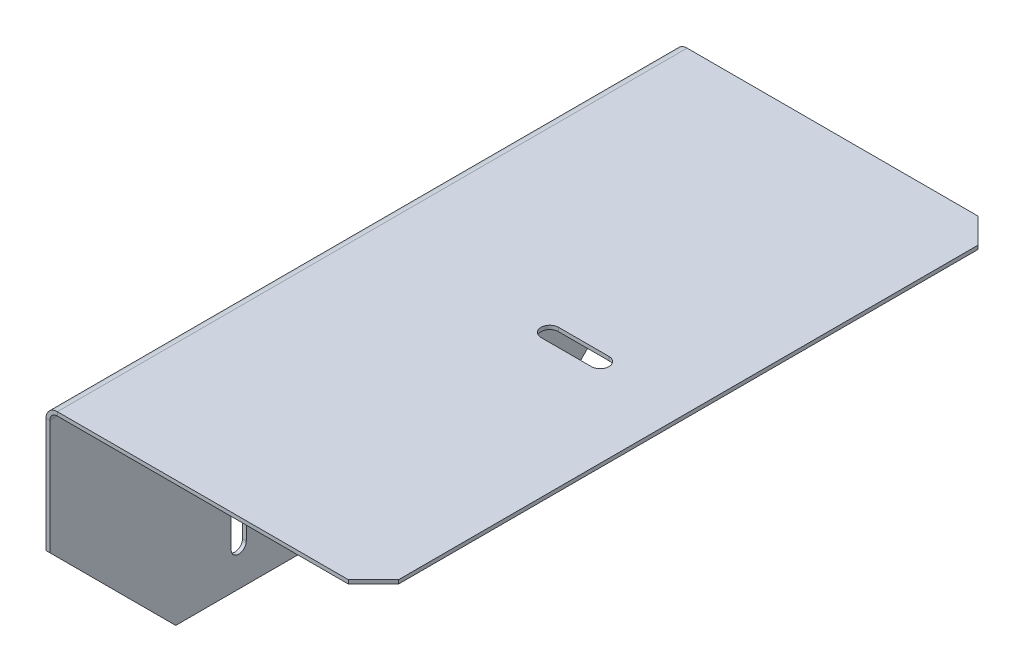
ISO-10303-21;
HEADER;
FILE_DESCRIPTION(('STEP AP214'),'2;1');
FILE_NAME('part.step','',(''),(''),'','','');
FILE_SCHEMA(('AUTOMOTIVE_DESIGN { 1 0 10303 214 1 1 1 1 }'));
ENDSEC;
DATA;
#1=APPLICATION_CONTEXT('core data for automotive mechanical design processes');
#2=APPLICATION_PROTOCOL_DEFINITION('international standard','automotive_design',2000,#1);
#3=PRODUCT_CONTEXT('',#1,'mechanical');
#4=PRODUCT('Part','Part','',(#3));
#5=PRODUCT_RELATED_PRODUCT_CATEGORY('part','',(#4));
#6=PRODUCT_DEFINITION_FORMATION('','',#4);
#7=PRODUCT_DEFINITION_CONTEXT('part definition',#1,'design');
#8=PRODUCT_DEFINITION('design','',#6,#7);
#9=PRODUCT_DEFINITION_SHAPE('','',#8);
#10=(LENGTH_UNIT() NAMED_UNIT(*) SI_UNIT(.MILLI.,.METRE.));
#11=(NAMED_UNIT(*) PLANE_ANGLE_UNIT() SI_UNIT($,.RADIAN.));
#12=(NAMED_UNIT(*) SI_UNIT($,.STERADIAN.) SOLID_ANGLE_UNIT());
#13=UNCERTAINTY_MEASURE_WITH_UNIT(LENGTH_MEASURE(1.E-05),#10,'distance_accuracy_value','');
#14=(GEOMETRIC_REPRESENTATION_CONTEXT(3) GLOBAL_UNCERTAINTY_ASSIGNED_CONTEXT((#13)) GLOBAL_UNIT_ASSIGNED_CONTEXT((#10,
#11,#12)) REPRESENTATION_CONTEXT('',''));
#15=CARTESIAN_POINT('',(0.,0.,0.));
#16=DIRECTION('',(0.,0.,1.));
#17=DIRECTION('',(1.,0.,0.));
#18=AXIS2_PLACEMENT_3D('',#15,#16,#17);
#19=CARTESIAN_POINT('',(4.5,100.,250.));
#20=DIRECTION('',(0.,0.,1.));
#21=DIRECTION('',(1.,0.,0.));
#22=AXIS2_PLACEMENT_3D('',#19,#20,#21);
#23=PLANE('',#22);
#24=DIRECTION('',(0.,-1.,0.));
#25=VECTOR('',#24,1.);
#26=CARTESIAN_POINT('',(4.5,100.,250.));
#27=LINE('',#26,#25);
#28=CARTESIAN_POINT('',(4.5,100.,250.));
#29=VERTEX_POINT('',#28);
#30=CARTESIAN_POINT('',(4.5,98.5,250.));
#31=VERTEX_POINT('',#30);
#32=EDGE_CURVE('E377',#29,#31,#27,.T.);
#33=ORIENTED_EDGE('',*,*,#32,.F.);
#34=CARTESIAN_POINT('',(4.5,95.5,250.));
#35=DIRECTION('',(0.,0.,1.));
#36=DIRECTION('',(1.,0.,0.));
#37=AXIS2_PLACEMENT_3D('',#34,#35,#36);
#38=CIRCLE('',#37,4.5);
#39=CARTESIAN_POINT('',(0.,95.5,250.));
#40=VERTEX_POINT('',#39);
#41=EDGE_CURVE('E322',#40,#29,#38,.F.);
#42=ORIENTED_EDGE('',*,*,#41,.F.);
#43=DIRECTION('',(-1.,0.,0.));
#44=VECTOR('',#43,1.);
#45=CARTESIAN_POINT('',(1.5,95.5,250.));
#46=LINE('',#45,#44);
#47=CARTESIAN_POINT('',(1.5,95.5,250.));
#48=VERTEX_POINT('',#47);
#49=EDGE_CURVE('E374',#48,#40,#46,.T.);
#50=ORIENTED_EDGE('',*,*,#49,.F.);
#51=CARTESIAN_POINT('',(4.5,95.5,250.));
#52=DIRECTION('',(0.,0.,1.));
#53=DIRECTION('',(1.,0.,0.));
#54=AXIS2_PLACEMENT_3D('',#51,#52,#53);
#55=CIRCLE('',#54,3.);
#56=EDGE_CURVE('E329',#48,#31,#55,.F.);
#57=ORIENTED_EDGE('',*,*,#56,.T.);
#58=EDGE_LOOP('',(#33,#42,#50,#57));
#59=FACE_BOUND('',#58,.T.);
#60=ADVANCED_FACE('F48',(#59),#23,.T.);
#61=CARTESIAN_POINT('',(1.5,95.5,250.));
#62=DIRECTION('',(0.,0.,1.));
#63=DIRECTION('',(1.,0.,0.));
#64=AXIS2_PLACEMENT_3D('',#61,#62,#63);
#65=PLANE('',#64);
#66=DIRECTION('',(1.,0.,0.));
#67=VECTOR('',#66,1.);
#68=CARTESIAN_POINT('',(0.,98.5,250.));
#69=LINE('',#68,#67);
#70=CARTESIAN_POINT('',(120.,98.5,250.));
#71=VERTEX_POINT('',#70);
#72=EDGE_CURVE('E315',#31,#71,#69,.T.);
#73=ORIENTED_EDGE('',*,*,#72,.T.);
#74=DIRECTION('',(0.,1.,0.));
#75=VECTOR('',#74,1.);
#76=CARTESIAN_POINT('',(120.,95.5,250.));
#77=LINE('',#76,#75);
#78=CARTESIAN_POINT('',(120.,100.,250.));
#79=VERTEX_POINT('',#78);
#80=EDGE_CURVE('E395',#71,#79,#77,.T.);
#81=ORIENTED_EDGE('',*,*,#80,.T.);
#82=DIRECTION('',(1.,0.,0.));
#83=VECTOR('',#82,1.);
#84=CARTESIAN_POINT('',(0.,100.,250.));
#85=LINE('',#84,#83);
#86=EDGE_CURVE('E318',#29,#79,#85,.T.);
#87=ORIENTED_EDGE('',*,*,#86,.F.);
#88=ORIENTED_EDGE('',*,*,#32,.T.);
#89=EDGE_LOOP('',(#73,#81,#87,#88));
#90=FACE_BOUND('',#89,.T.);
#91=ADVANCED_FACE('F437',(#90),#65,.T.);
#92=CARTESIAN_POINT('',(0.,95.5,0.));
#93=DIRECTION('',(0.,0.,-1.));
#94=DIRECTION('',(-1.,0.,0.));
#95=AXIS2_PLACEMENT_3D('',#92,#93,#94);
#96=PLANE('',#95);
#97=DIRECTION('',(1.,0.,0.));
#98=VECTOR('',#97,1.);
#99=CARTESIAN_POINT('',(0.,95.5,0.));
#100=LINE('',#99,#98);
#101=CARTESIAN_POINT('',(0.,95.5,0.));
#102=VERTEX_POINT('',#101);
#103=CARTESIAN_POINT('',(1.5,95.5,0.));
#104=VERTEX_POINT('',#103);
#105=EDGE_CURVE('E371',#102,#104,#100,.T.);
#106=ORIENTED_EDGE('',*,*,#105,.F.);
#107=CARTESIAN_POINT('',(4.5,95.5,0.));
#108=DIRECTION('',(0.,0.,1.));
#109=DIRECTION('',(1.,0.,0.));
#110=AXIS2_PLACEMENT_3D('',#107,#108,#109);
#111=CIRCLE('',#110,4.5);
#112=CARTESIAN_POINT('',(4.5,100.,0.));
#113=VERTEX_POINT('',#112);
#114=EDGE_CURVE('E338',#102,#113,#111,.F.);
#115=ORIENTED_EDGE('',*,*,#114,.T.);
#116=DIRECTION('',(0.,1.,0.));
#117=VECTOR('',#116,1.);
#118=CARTESIAN_POINT('',(4.5,98.5,0.));
#119=LINE('',#118,#117);
#120=CARTESIAN_POINT('',(4.5,98.5,0.));
#121=VERTEX_POINT('',#120);
#122=EDGE_CURVE('E369',#121,#113,#119,.T.);
#123=ORIENTED_EDGE('',*,*,#122,.F.);
#124=CARTESIAN_POINT('',(4.5,95.5,0.));
#125=DIRECTION('',(0.,0.,1.));
#126=DIRECTION('',(1.,0.,0.));
#127=AXIS2_PLACEMENT_3D('',#124,#125,#126);
#128=CIRCLE('',#127,3.);
#129=EDGE_CURVE('E319',#104,#121,#128,.F.);
#130=ORIENTED_EDGE('',*,*,#129,.F.);
#131=EDGE_LOOP('',(#106,#115,#123,#130));
#132=FACE_BOUND('',#131,.T.);
#133=ADVANCED_FACE('F458',(#132),#96,.T.);
#134=CARTESIAN_POINT('',(4.5,98.5,0.));
#135=DIRECTION('',(0.,0.,-1.));
#136=DIRECTION('',(-1.,0.,0.));
#137=AXIS2_PLACEMENT_3D('',#134,#135,#136);
#138=PLANE('',#137);
#139=DIRECTION('',(0.,1.,0.));
#140=VECTOR('',#139,1.);
#141=CARTESIAN_POINT('',(1.5,0.,0.));
#142=LINE('',#141,#140);
#143=CARTESIAN_POINT('',(1.5,50.,0.));
#144=VERTEX_POINT('',#143);
#145=EDGE_CURVE('E343',#144,#104,#142,.T.);
#146=ORIENTED_EDGE('',*,*,#145,.F.);
#147=DIRECTION('',(-1.,0.,0.));
#148=VECTOR('',#147,1.);
#149=CARTESIAN_POINT('',(4.5,50.,0.));
#150=LINE('',#149,#148);
#151=CARTESIAN_POINT('',(0.,50.0000000000001,0.));
#152=VERTEX_POINT('',#151);
#153=EDGE_CURVE('E13',#144,#152,#150,.T.);
#154=ORIENTED_EDGE('',*,*,#153,.T.);
#155=DIRECTION('',(0.,1.,0.));
#156=VECTOR('',#155,1.);
#157=CARTESIAN_POINT('',(0.,0.,0.));
#158=LINE('',#157,#156);
#159=EDGE_CURVE('E341',#152,#102,#158,.T.);
#160=ORIENTED_EDGE('',*,*,#159,.T.);
#161=ORIENTED_EDGE('',*,*,#105,.T.);
#162=EDGE_LOOP('',(#146,#154,#160,#161));
#163=FACE_BOUND('',#162,.T.);
#164=ADVANCED_FACE('F464',(#163),#138,.T.);
#165=CARTESIAN_POINT('',(0.,98.5,250.));
#166=DIRECTION('',(0.,1.,0.));
#167=DIRECTION('',(0.,0.,1.));
#168=AXIS2_PLACEMENT_3D('',#165,#166,#167);
#169=PLANE('',#168);
#170=DIRECTION('',(1.,0.,0.));
#171=VECTOR('',#170,1.);
#172=CARTESIAN_POINT('',(0.,98.5,128.5));
#173=LINE('',#172,#171);
#174=CARTESIAN_POINT('',(75.,98.5,128.5));
#175=VERTEX_POINT('',#174);
#176=CARTESIAN_POINT('',(95.,98.5,128.5));
#177=VERTEX_POINT('',#176);
#178=EDGE_CURVE('E308',#175,#177,#173,.T.);
#179=ORIENTED_EDGE('',*,*,#178,.T.);
#180=CARTESIAN_POINT('',(95.,98.5,125.));
#181=DIRECTION('',(0.,1.,0.));
#182=DIRECTION('',(0.,0.,1.));
#183=AXIS2_PLACEMENT_3D('',#180,#181,#182);
#184=CIRCLE('',#183,3.5);
#185=CARTESIAN_POINT('',(95.,98.5,121.5));
#186=VERTEX_POINT('',#185);
#187=EDGE_CURVE('E311',#177,#186,#184,.T.);
#188=ORIENTED_EDGE('',*,*,#187,.T.);
#189=DIRECTION('',(-1.,0.,0.));
#190=VECTOR('',#189,1.);
#191=CARTESIAN_POINT('',(0.,98.5,121.5));
#192=LINE('',#191,#190);
#193=CARTESIAN_POINT('',(75.,98.5,121.5));
#194=VERTEX_POINT('',#193);
#195=EDGE_CURVE('E296',#186,#194,#192,.T.);
#196=ORIENTED_EDGE('',*,*,#195,.T.);
#197=CARTESIAN_POINT('',(75.,98.5,125.));
#198=DIRECTION('',(0.,1.,0.));
#199=DIRECTION('',(0.,0.,1.));
#200=AXIS2_PLACEMENT_3D('',#197,#198,#199);
#201=CIRCLE('',#200,3.5);
#202=EDGE_CURVE('E305',#194,#175,#201,.T.);
#203=ORIENTED_EDGE('',*,*,#202,.T.);
#204=EDGE_LOOP('',(#179,#188,#196,#203));
#205=FACE_BOUND('',#204,.T.);
#206=DIRECTION('',(1.,0.,0.));
#207=VECTOR('',#206,1.);
#208=CARTESIAN_POINT('',(0.,98.5,0.));
#209=LINE('',#208,#207);
#210=CARTESIAN_POINT('',(120.,98.5,0.));
#211=VERTEX_POINT('',#210);
#212=EDGE_CURVE('E314',#121,#211,#209,.T.);
#213=ORIENTED_EDGE('',*,*,#212,.T.);
#214=DIRECTION('',(0.707106781186548,0.,0.707106781186548));
#215=VECTOR('',#214,1.);
#216=CARTESIAN_POINT('',(120.,98.5,0.));
#217=LINE('',#216,#215);
#218=CARTESIAN_POINT('',(130.,98.5,10.0000000000001));
#219=VERTEX_POINT('',#218);
#220=EDGE_CURVE('E384',#211,#219,#217,.T.);
#221=ORIENTED_EDGE('',*,*,#220,.T.);
#222=DIRECTION('',(0.,0.,-1.));
#223=VECTOR('',#222,1.);
#224=CARTESIAN_POINT('',(130.,98.5,250.));
#225=LINE('',#224,#223);
#226=CARTESIAN_POINT('',(130.,98.5,240.));
#227=VERTEX_POINT('',#226);
#228=EDGE_CURVE('E366',#227,#219,#225,.T.);
#229=ORIENTED_EDGE('',*,*,#228,.F.);
#230=DIRECTION('',(0.70710678118655,0.,-0.707106781186545));
#231=VECTOR('',#230,1.);
#232=CARTESIAN_POINT('',(130.,98.5,240.));
#233=LINE('',#232,#231);
#234=EDGE_CURVE('E382',#227,#71,#233,.F.);
#235=ORIENTED_EDGE('',*,*,#234,.T.);
#236=ORIENTED_EDGE('',*,*,#72,.F.);
#237=DIRECTION('',(0.,0.,-1.));
#238=VECTOR('',#237,1.);
#239=CARTESIAN_POINT('',(4.5,98.5,250.));
#240=LINE('',#239,#238);
#241=EDGE_CURVE('E332',#31,#121,#240,.T.);
#242=ORIENTED_EDGE('',*,*,#241,.T.);
#243=EDGE_LOOP('',(#213,#221,#229,#235,#236,#242));
#244=FACE_BOUND('',#243,.T.);
#245=ADVANCED_FACE('F462',(#205,#244),#169,.F.);
#246=CARTESIAN_POINT('',(130.,100.,250.));
#247=DIRECTION('',(1.,0.,0.));
#248=DIRECTION('',(0.,0.,-1.));
#249=AXIS2_PLACEMENT_3D('',#246,#247,#248);
#250=PLANE('',#249);
#251=ORIENTED_EDGE('',*,*,#228,.T.);
#252=DIRECTION('',(0.,1.,0.));
#253=VECTOR('',#252,1.);
#254=CARTESIAN_POINT('',(130.,100.,10.0000000000001));
#255=LINE('',#254,#253);
#256=CARTESIAN_POINT('',(130.,100.,10.0000000000002));
#257=VERTEX_POINT('',#256);
#258=EDGE_CURVE('E389',#219,#257,#255,.T.);
#259=ORIENTED_EDGE('',*,*,#258,.T.);
#260=DIRECTION('',(0.,0.,-1.));
#261=VECTOR('',#260,1.);
#262=CARTESIAN_POINT('',(130.,100.,250.));
#263=LINE('',#262,#261);
#264=CARTESIAN_POINT('',(130.,100.,240.));
#265=VERTEX_POINT('',#264);
#266=EDGE_CURVE('E363',#265,#257,#263,.T.);
#267=ORIENTED_EDGE('',*,*,#266,.F.);
#268=DIRECTION('',(0.,-1.,0.));
#269=VECTOR('',#268,1.);
#270=CARTESIAN_POINT('',(130.,100.,240.));
#271=LINE('',#270,#269);
#272=EDGE_CURVE('E386',#265,#227,#271,.T.);
#273=ORIENTED_EDGE('',*,*,#272,.T.);
#274=EDGE_LOOP('',(#251,#259,#267,#273));
#275=FACE_BOUND('',#274,.T.);
#276=ADVANCED_FACE('F446',(#275),#250,.T.);
#277=CARTESIAN_POINT('',(0.,100.,250.));
#278=DIRECTION('',(0.,1.,0.));
#279=DIRECTION('',(0.,0.,1.));
#280=AXIS2_PLACEMENT_3D('',#277,#278,#279);
#281=PLANE('',#280);
#282=CARTESIAN_POINT('',(95.,100.,125.));
#283=DIRECTION('',(0.,1.,0.));
#284=DIRECTION('',(0.,0.,1.));
#285=AXIS2_PLACEMENT_3D('',#282,#283,#284);
#286=CIRCLE('',#285,3.5);
#287=CARTESIAN_POINT('',(95.,100.,128.5));
#288=VERTEX_POINT('',#287);
#289=CARTESIAN_POINT('',(95.,100.,121.5));
#290=VERTEX_POINT('',#289);
#291=EDGE_CURVE('E282',#288,#290,#286,.T.);
#292=ORIENTED_EDGE('',*,*,#291,.F.);
#293=DIRECTION('',(1.,0.,0.));
#294=VECTOR('',#293,1.);
#295=CARTESIAN_POINT('',(95.,100.,128.5));
#296=LINE('',#295,#294);
#297=CARTESIAN_POINT('',(75.,100.,128.5));
#298=VERTEX_POINT('',#297);
#299=EDGE_CURVE('E290',#298,#288,#296,.T.);
#300=ORIENTED_EDGE('',*,*,#299,.F.);
#301=CARTESIAN_POINT('',(75.,100.,125.));
#302=DIRECTION('',(0.,1.,0.));
#303=DIRECTION('',(0.,0.,1.));
#304=AXIS2_PLACEMENT_3D('',#301,#302,#303);
#305=CIRCLE('',#304,3.5);
#306=CARTESIAN_POINT('',(75.,100.,121.5));
#307=VERTEX_POINT('',#306);
#308=EDGE_CURVE('E287',#307,#298,#305,.T.);
#309=ORIENTED_EDGE('',*,*,#308,.F.);
#310=DIRECTION('',(-1.,0.,0.));
#311=VECTOR('',#310,1.);
#312=CARTESIAN_POINT('',(95.,100.,121.5));
#313=LINE('',#312,#311);
#314=EDGE_CURVE('E284',#290,#307,#313,.T.);
#315=ORIENTED_EDGE('',*,*,#314,.F.);
#316=EDGE_LOOP('',(#292,#300,#309,#315));
#317=FACE_BOUND('',#316,.T.);
#318=ORIENTED_EDGE('',*,*,#266,.T.);
#319=DIRECTION('',(-0.707106781186548,0.,-0.707106781186548));
#320=VECTOR('',#319,1.);
#321=CARTESIAN_POINT('',(185.,100.,65.0000000000001));
#322=LINE('',#321,#320);
#323=CARTESIAN_POINT('',(120.,100.,0.));
#324=VERTEX_POINT('',#323);
#325=EDGE_CURVE('E393',#257,#324,#322,.T.);
#326=ORIENTED_EDGE('',*,*,#325,.T.);
#327=DIRECTION('',(1.,0.,0.));
#328=VECTOR('',#327,1.);
#329=CARTESIAN_POINT('',(0.,100.,0.));
#330=LINE('',#329,#328);
#331=EDGE_CURVE('E335',#113,#324,#330,.T.);
#332=ORIENTED_EDGE('',*,*,#331,.F.);
#333=DIRECTION('',(0.,0.,-1.));
#334=VECTOR('',#333,1.);
#335=CARTESIAN_POINT('',(4.5,100.,250.));
#336=LINE('',#335,#334);
#337=EDGE_CURVE('E360',#29,#113,#336,.T.);
#338=ORIENTED_EDGE('',*,*,#337,.F.);
#339=ORIENTED_EDGE('',*,*,#86,.T.);
#340=DIRECTION('',(-0.70710678118655,0.,0.707106781186545));
#341=VECTOR('',#340,1.);
#342=CARTESIAN_POINT('',(59.9999999999995,100.,310.));
#343=LINE('',#342,#341);
#344=EDGE_CURVE('E391',#79,#265,#343,.F.);
#345=ORIENTED_EDGE('',*,*,#344,.T.);
#346=EDGE_LOOP('',(#318,#326,#332,#338,#339,#345));
#347=FACE_BOUND('',#346,.T.);
#348=ADVANCED_FACE('F435',(#317,#347),#281,.T.);
#349=CARTESIAN_POINT('',(4.5,95.5,250.));
#350=DIRECTION('',(0.,0.,-1.));
#351=DIRECTION('',(-1.,0.,0.));
#352=AXIS2_PLACEMENT_3D('',#349,#350,#351);
#353=CYLINDRICAL_SURFACE('',#352,4.5);
#354=ORIENTED_EDGE('',*,*,#114,.F.);
#355=DIRECTION('',(0.,0.,-1.));
#356=VECTOR('',#355,1.);
#357=CARTESIAN_POINT('',(0.,95.5,250.));
#358=LINE('',#357,#356);
#359=EDGE_CURVE('E357',#40,#102,#358,.T.);
#360=ORIENTED_EDGE('',*,*,#359,.F.);
#361=ORIENTED_EDGE('',*,*,#41,.T.);
#362=ORIENTED_EDGE('',*,*,#337,.T.);
#363=EDGE_LOOP('',(#354,#360,#361,#362));
#364=FACE_BOUND('',#363,.T.);
#365=ADVANCED_FACE('F426',(#364),#353,.T.);
#366=CARTESIAN_POINT('',(0.,0.,250.));
#367=DIRECTION('',(-1.,0.,0.));
#368=DIRECTION('',(0.,0.,1.));
#369=AXIS2_PLACEMENT_3D('',#366,#367,#368);
#370=PLANE('',#369);
#371=CARTESIAN_POINT('',(0.,15.,75.));
#372=DIRECTION('',(-1.,0.,0.));
#373=DIRECTION('',(0.,0.,1.));
#374=AXIS2_PLACEMENT_3D('',#371,#372,#373);
#375=CIRCLE('',#374,2.99999999999999);
#376=CARTESIAN_POINT('',(0.,15.,72.));
#377=VERTEX_POINT('',#376);
#378=CARTESIAN_POINT('',(0.,15.,78.));
#379=VERTEX_POINT('',#378);
#380=EDGE_CURVE('E251',#377,#379,#375,.T.);
#381=ORIENTED_EDGE('',*,*,#380,.F.);
#382=DIRECTION('',(0.,-1.,0.));
#383=VECTOR('',#382,1.);
#384=CARTESIAN_POINT('',(0.,0.,72.));
#385=LINE('',#384,#383);
#386=CARTESIAN_POINT('',(0.,80.,72.0000000000001));
#387=VERTEX_POINT('',#386);
#388=EDGE_CURVE('E244',#387,#377,#385,.T.);
#389=ORIENTED_EDGE('',*,*,#388,.F.);
#390=CARTESIAN_POINT('',(0.,80.,75.));
#391=DIRECTION('',(-1.,0.,0.));
#392=DIRECTION('',(0.,0.,1.));
#393=AXIS2_PLACEMENT_3D('',#390,#391,#392);
#394=CIRCLE('',#393,2.99999999999998);
#395=CARTESIAN_POINT('',(0.,80.,78.));
#396=VERTEX_POINT('',#395);
#397=EDGE_CURVE('E219',#396,#387,#394,.T.);
#398=ORIENTED_EDGE('',*,*,#397,.F.);
#399=DIRECTION('',(0.,1.,0.));
#400=VECTOR('',#399,1.);
#401=CARTESIAN_POINT('',(0.,0.,78.));
#402=LINE('',#401,#400);
#403=EDGE_CURVE('E249',#379,#396,#402,.T.);
#404=ORIENTED_EDGE('',*,*,#403,.F.);
#405=EDGE_LOOP('',(#381,#389,#398,#404));
#406=FACE_BOUND('',#405,.T.);
#407=CARTESIAN_POINT('',(0.,15.,175.));
#408=DIRECTION('',(-1.,0.,0.));
#409=DIRECTION('',(0.,0.,1.));
#410=AXIS2_PLACEMENT_3D('',#407,#408,#409);
#411=CIRCLE('',#410,3.);
#412=CARTESIAN_POINT('',(0.,15.,172.));
#413=VERTEX_POINT('',#412);
#414=CARTESIAN_POINT('',(0.,15.,178.));
#415=VERTEX_POINT('',#414);
#416=EDGE_CURVE('E280',#413,#415,#411,.T.);
#417=ORIENTED_EDGE('',*,*,#416,.F.);
#418=DIRECTION('',(0.,-1.,0.));
#419=VECTOR('',#418,1.);
#420=CARTESIAN_POINT('',(0.,0.,172.));
#421=LINE('',#420,#419);
#422=CARTESIAN_POINT('',(0.,80.,172.));
#423=VERTEX_POINT('',#422);
#424=EDGE_CURVE('E267',#423,#413,#421,.T.);
#425=ORIENTED_EDGE('',*,*,#424,.F.);
#426=CARTESIAN_POINT('',(0.,80.,175.));
#427=DIRECTION('',(-1.,0.,0.));
#428=DIRECTION('',(0.,0.,1.));
#429=AXIS2_PLACEMENT_3D('',#426,#427,#428);
#430=CIRCLE('',#429,3.);
#431=CARTESIAN_POINT('',(0.,80.,178.));
#432=VERTEX_POINT('',#431);
#433=EDGE_CURVE('E275',#432,#423,#430,.T.);
#434=ORIENTED_EDGE('',*,*,#433,.F.);
#435=DIRECTION('',(0.,1.,0.));
#436=VECTOR('',#435,1.);
#437=CARTESIAN_POINT('',(0.,0.,178.));
#438=LINE('',#437,#436);
#439=EDGE_CURVE('E278',#415,#432,#438,.T.);
#440=ORIENTED_EDGE('',*,*,#439,.F.);
#441=EDGE_LOOP('',(#417,#425,#434,#440));
#442=FACE_BOUND('',#441,.T.);
#443=DIRECTION('',(0.,0.,-1.));
#444=VECTOR('',#443,1.);
#445=CARTESIAN_POINT('',(0.,0.,250.));
#446=LINE('',#445,#444);
#447=CARTESIAN_POINT('',(0.,0.,200.));
#448=VERTEX_POINT('',#447);
#449=CARTESIAN_POINT('',(0.,0.,50.0000000000002));
#450=VERTEX_POINT('',#449);
#451=EDGE_CURVE('E354',#448,#450,#446,.T.);
#452=ORIENTED_EDGE('',*,*,#451,.F.);
#453=DIRECTION('',(0.,-0.707106781186549,-0.707106781186546));
#454=VECTOR('',#453,1.);
#455=CARTESIAN_POINT('',(0.,25.,225.));
#456=LINE('',#455,#454);
#457=CARTESIAN_POINT('',(0.,50.0000000000002,250.));
#458=VERTEX_POINT('',#457);
#459=EDGE_CURVE('E404',#448,#458,#456,.F.);
#460=ORIENTED_EDGE('',*,*,#459,.T.);
#461=DIRECTION('',(0.,1.,0.));
#462=VECTOR('',#461,1.);
#463=CARTESIAN_POINT('',(0.,0.,250.));
#464=LINE('',#463,#462);
#465=EDGE_CURVE('E325',#458,#40,#464,.T.);
#466=ORIENTED_EDGE('',*,*,#465,.T.);
#467=ORIENTED_EDGE('',*,*,#359,.T.);
#468=ORIENTED_EDGE('',*,*,#159,.F.);
#469=DIRECTION('',(0.,0.707106781186547,-0.707106781186549));
#470=VECTOR('',#469,1.);
#471=CARTESIAN_POINT('',(0.,-99.9999999999999,150.));
#472=LINE('',#471,#470);
#473=EDGE_CURVE('E402',#152,#450,#472,.F.);
#474=ORIENTED_EDGE('',*,*,#473,.T.);
#475=EDGE_LOOP('',(#452,#460,#466,#467,#468,#474));
#476=FACE_BOUND('',#475,.T.);
#477=ADVANCED_FACE('F418',(#406,#442,#476),#370,.T.);
#478=CARTESIAN_POINT('',(1.5,0.,250.));
#479=DIRECTION('',(0.,-1.,0.));
#480=DIRECTION('',(0.,0.,-1.));
#481=AXIS2_PLACEMENT_3D('',#478,#479,#480);
#482=PLANE('',#481);
#483=DIRECTION('',(0.,0.,-1.));
#484=VECTOR('',#483,1.);
#485=CARTESIAN_POINT('',(1.5,0.,250.));
#486=LINE('',#485,#484);
#487=CARTESIAN_POINT('',(1.5,0.,200.));
#488=VERTEX_POINT('',#487);
#489=CARTESIAN_POINT('',(1.5,0.,50.0000000000003));
#490=VERTEX_POINT('',#489);
#491=EDGE_CURVE('E352',#488,#490,#486,.T.);
#492=ORIENTED_EDGE('',*,*,#491,.F.);
#493=DIRECTION('',(-1.,0.,0.));
#494=VECTOR('',#493,1.);
#495=CARTESIAN_POINT('',(1.5,0.,200.));
#496=LINE('',#495,#494);
#497=EDGE_CURVE('E399',#488,#448,#496,.T.);
#498=ORIENTED_EDGE('',*,*,#497,.T.);
#499=ORIENTED_EDGE('',*,*,#451,.T.);
#500=DIRECTION('',(1.,0.,0.));
#501=VECTOR('',#500,1.);
#502=CARTESIAN_POINT('',(1.5,0.,50.0000000000002));
#503=LINE('',#502,#501);
#504=EDGE_CURVE('E397',#450,#490,#503,.T.);
#505=ORIENTED_EDGE('',*,*,#504,.T.);
#506=EDGE_LOOP('',(#492,#498,#499,#505));
#507=FACE_BOUND('',#506,.T.);
#508=ADVANCED_FACE('F413',(#507),#482,.T.);
#509=CARTESIAN_POINT('',(1.5,0.,250.));
#510=DIRECTION('',(-1.,0.,0.));
#511=DIRECTION('',(0.,0.,1.));
#512=AXIS2_PLACEMENT_3D('',#509,#510,#511);
#513=PLANE('',#512);
#514=DIRECTION('',(0.,1.,0.));
#515=VECTOR('',#514,1.);
#516=CARTESIAN_POINT('',(1.5,15.,72.));
#517=LINE('',#516,#515);
#518=CARTESIAN_POINT('',(1.5,15.,72.));
#519=VERTEX_POINT('',#518);
#520=CARTESIAN_POINT('',(1.5,80.,72.0000000000001));
#521=VERTEX_POINT('',#520);
#522=EDGE_CURVE('E227',#519,#521,#517,.T.);
#523=ORIENTED_EDGE('',*,*,#522,.F.);
#524=CARTESIAN_POINT('',(1.5,15.,75.));
#525=DIRECTION('',(1.,0.,0.));
#526=DIRECTION('',(0.,0.,-1.));
#527=AXIS2_PLACEMENT_3D('',#524,#525,#526);
#528=CIRCLE('',#527,2.99999999999999);
#529=CARTESIAN_POINT('',(1.5,15.,78.));
#530=VERTEX_POINT('',#529);
#531=EDGE_CURVE('E232',#530,#519,#528,.T.);
#532=ORIENTED_EDGE('',*,*,#531,.F.);
#533=DIRECTION('',(0.,-1.,0.));
#534=VECTOR('',#533,1.);
#535=CARTESIAN_POINT('',(1.5,15.,78.));
#536=LINE('',#535,#534);
#537=CARTESIAN_POINT('',(1.5,80.,78.));
#538=VERTEX_POINT('',#537);
#539=EDGE_CURVE('E237',#538,#530,#536,.T.);
#540=ORIENTED_EDGE('',*,*,#539,.F.);
#541=CARTESIAN_POINT('',(1.5,80.,75.));
#542=DIRECTION('',(1.,0.,0.));
#543=DIRECTION('',(0.,0.,-1.));
#544=AXIS2_PLACEMENT_3D('',#541,#542,#543);
#545=CIRCLE('',#544,2.99999999999998);
#546=EDGE_CURVE('E216',#521,#538,#545,.T.);
#547=ORIENTED_EDGE('',*,*,#546,.F.);
#548=EDGE_LOOP('',(#523,#532,#540,#547));
#549=FACE_BOUND('',#548,.T.);
#550=DIRECTION('',(0.,1.,0.));
#551=VECTOR('',#550,1.);
#552=CARTESIAN_POINT('',(1.5,15.,172.));
#553=LINE('',#552,#551);
#554=CARTESIAN_POINT('',(1.5,15.,172.));
#555=VERTEX_POINT('',#554);
#556=CARTESIAN_POINT('',(1.5,80.,172.));
#557=VERTEX_POINT('',#556);
#558=EDGE_CURVE('E255',#555,#557,#553,.T.);
#559=ORIENTED_EDGE('',*,*,#558,.F.);
#560=CARTESIAN_POINT('',(1.5,15.,175.));
#561=DIRECTION('',(1.,0.,0.));
#562=DIRECTION('',(0.,0.,-1.));
#563=AXIS2_PLACEMENT_3D('',#560,#561,#562);
#564=CIRCLE('',#563,3.);
#565=CARTESIAN_POINT('',(1.5,15.,178.));
#566=VERTEX_POINT('',#565);
#567=EDGE_CURVE('E253',#566,#555,#564,.T.);
#568=ORIENTED_EDGE('',*,*,#567,.F.);
#569=DIRECTION('',(0.,-1.,0.));
#570=VECTOR('',#569,1.);
#571=CARTESIAN_POINT('',(1.5,15.,178.));
#572=LINE('',#571,#570);
#573=CARTESIAN_POINT('',(1.5,80.,178.));
#574=VERTEX_POINT('',#573);
#575=EDGE_CURVE('E261',#574,#566,#572,.T.);
#576=ORIENTED_EDGE('',*,*,#575,.F.);
#577=CARTESIAN_POINT('',(1.5,80.,175.));
#578=DIRECTION('',(1.,0.,0.));
#579=DIRECTION('',(0.,0.,-1.));
#580=AXIS2_PLACEMENT_3D('',#577,#578,#579);
#581=CIRCLE('',#580,3.);
#582=EDGE_CURVE('E258',#557,#574,#581,.T.);
#583=ORIENTED_EDGE('',*,*,#582,.F.);
#584=EDGE_LOOP('',(#559,#568,#576,#583));
#585=FACE_BOUND('',#584,.T.);
#586=DIRECTION('',(0.,1.,0.));
#587=VECTOR('',#586,1.);
#588=CARTESIAN_POINT('',(1.5,0.,250.));
#589=LINE('',#588,#587);
#590=CARTESIAN_POINT('',(1.5,50.0000000000003,250.));
#591=VERTEX_POINT('',#590);
#592=EDGE_CURVE('E327',#591,#48,#589,.T.);
#593=ORIENTED_EDGE('',*,*,#592,.F.);
#594=DIRECTION('',(0.,0.707106781186549,0.707106781186546));
#595=VECTOR('',#594,1.);
#596=CARTESIAN_POINT('',(1.5,0.,200.));
#597=LINE('',#596,#595);
#598=EDGE_CURVE('E56',#591,#488,#597,.F.);
#599=ORIENTED_EDGE('',*,*,#598,.T.);
#600=ORIENTED_EDGE('',*,*,#491,.T.);
#601=DIRECTION('',(0.,-0.707106781186547,0.707106781186549));
#602=VECTOR('',#601,1.);
#603=CARTESIAN_POINT('',(1.5,50.,0.));
#604=LINE('',#603,#602);
#605=EDGE_CURVE('E63',#490,#144,#604,.F.);
#606=ORIENTED_EDGE('',*,*,#605,.T.);
#607=ORIENTED_EDGE('',*,*,#145,.T.);
#608=DIRECTION('',(0.,0.,-1.));
#609=VECTOR('',#608,1.);
#610=CARTESIAN_POINT('',(1.5,95.5,250.));
#611=LINE('',#610,#609);
#612=EDGE_CURVE('E349',#48,#104,#611,.T.);
#613=ORIENTED_EDGE('',*,*,#612,.F.);
#614=EDGE_LOOP('',(#593,#599,#600,#606,#607,#613));
#615=FACE_BOUND('',#614,.T.);
#616=ADVANCED_FACE('F234',(#549,#585,#615),#513,.F.);
#617=CARTESIAN_POINT('',(4.5,95.5,250.));
#618=DIRECTION('',(0.,0.,-1.));
#619=DIRECTION('',(-1.,0.,0.));
#620=AXIS2_PLACEMENT_3D('',#617,#618,#619);
#621=CYLINDRICAL_SURFACE('',#620,3.);
#622=ORIENTED_EDGE('',*,*,#129,.T.);
#623=ORIENTED_EDGE('',*,*,#241,.F.);
#624=ORIENTED_EDGE('',*,*,#56,.F.);
#625=ORIENTED_EDGE('',*,*,#612,.T.);
#626=EDGE_LOOP('',(#622,#623,#624,#625));
#627=FACE_BOUND('',#626,.T.);
#628=ADVANCED_FACE('F460',(#627),#621,.F.);
#629=CARTESIAN_POINT('',(4.5,95.5,250.));
#630=DIRECTION('',(0.,0.,1.));
#631=DIRECTION('',(1.,0.,0.));
#632=AXIS2_PLACEMENT_3D('',#629,#630,#631);
#633=PLANE('',#632);
#634=ORIENTED_EDGE('',*,*,#465,.F.);
#635=DIRECTION('',(1.,0.,0.));
#636=VECTOR('',#635,1.);
#637=CARTESIAN_POINT('',(4.5,50.0000000000002,250.));
#638=LINE('',#637,#636);
#639=EDGE_CURVE('E71',#458,#591,#638,.T.);
#640=ORIENTED_EDGE('',*,*,#639,.T.);
#641=ORIENTED_EDGE('',*,*,#592,.T.);
#642=ORIENTED_EDGE('',*,*,#49,.T.);
#643=EDGE_LOOP('',(#634,#640,#641,#642));
#644=FACE_BOUND('',#643,.T.);
#645=ADVANCED_FACE('F419',(#644),#633,.T.);
#646=CARTESIAN_POINT('',(4.5,95.5,0.));
#647=DIRECTION('',(0.,0.,1.));
#648=DIRECTION('',(1.,0.,0.));
#649=AXIS2_PLACEMENT_3D('',#646,#647,#648);
#650=PLANE('',#649);
#651=ORIENTED_EDGE('',*,*,#331,.T.);
#652=DIRECTION('',(0.,-1.,0.));
#653=VECTOR('',#652,1.);
#654=CARTESIAN_POINT('',(120.,98.5,0.));
#655=LINE('',#654,#653);
#656=EDGE_CURVE('E379',#324,#211,#655,.T.);
#657=ORIENTED_EDGE('',*,*,#656,.T.);
#658=ORIENTED_EDGE('',*,*,#212,.F.);
#659=ORIENTED_EDGE('',*,*,#122,.T.);
#660=EDGE_LOOP('',(#651,#657,#658,#659));
#661=FACE_BOUND('',#660,.T.);
#662=ADVANCED_FACE('F453',(#661),#650,.F.);
#663=CARTESIAN_POINT('',(95.,90.,125.));
#664=DIRECTION('',(0.,1.,0.));
#665=DIRECTION('',(0.,0.,1.));
#666=AXIS2_PLACEMENT_3D('',#663,#664,#665);
#667=CYLINDRICAL_SURFACE('',#666,3.5);
#668=DIRECTION('',(0.,1.,0.));
#669=VECTOR('',#668,1.);
#670=CARTESIAN_POINT('',(95.,90.,128.5));
#671=LINE('',#670,#669);
#672=EDGE_CURVE('E294',#177,#288,#671,.T.);
#673=ORIENTED_EDGE('',*,*,#672,.T.);
#674=ORIENTED_EDGE('',*,*,#291,.T.);
#675=DIRECTION('',(0.,1.,0.));
#676=VECTOR('',#675,1.);
#677=CARTESIAN_POINT('',(95.,90.,121.5));
#678=LINE('',#677,#676);
#679=EDGE_CURVE('E293',#186,#290,#678,.T.);
#680=ORIENTED_EDGE('',*,*,#679,.F.);
#681=ORIENTED_EDGE('',*,*,#187,.F.);
#682=EDGE_LOOP('',(#673,#674,#680,#681));
#683=FACE_BOUND('',#682,.T.);
#684=ADVANCED_FACE('F524',(#683),#667,.F.);
#685=CARTESIAN_POINT('',(95.,90.,128.5));
#686=DIRECTION('',(0.,0.,1.));
#687=DIRECTION('',(1.,0.,0.));
#688=AXIS2_PLACEMENT_3D('',#685,#686,#687);
#689=PLANE('',#688);
#690=DIRECTION('',(0.,1.,0.));
#691=VECTOR('',#690,1.);
#692=CARTESIAN_POINT('',(75.,90.,128.5));
#693=LINE('',#692,#691);
#694=EDGE_CURVE('E297',#175,#298,#693,.T.);
#695=ORIENTED_EDGE('',*,*,#694,.T.);
#696=ORIENTED_EDGE('',*,*,#299,.T.);
#697=ORIENTED_EDGE('',*,*,#672,.F.);
#698=ORIENTED_EDGE('',*,*,#178,.F.);
#699=EDGE_LOOP('',(#695,#696,#697,#698));
#700=FACE_BOUND('',#699,.T.);
#701=ADVANCED_FACE('F520',(#700),#689,.F.);
#702=CARTESIAN_POINT('',(75.,90.,125.));
#703=DIRECTION('',(0.,1.,0.));
#704=DIRECTION('',(0.,0.,1.));
#705=AXIS2_PLACEMENT_3D('',#702,#703,#704);
#706=CYLINDRICAL_SURFACE('',#705,3.5);
#707=DIRECTION('',(0.,1.,0.));
#708=VECTOR('',#707,1.);
#709=CARTESIAN_POINT('',(75.,90.,121.5));
#710=LINE('',#709,#708);
#711=EDGE_CURVE('E299',#194,#307,#710,.T.);
#712=ORIENTED_EDGE('',*,*,#711,.T.);
#713=ORIENTED_EDGE('',*,*,#308,.T.);
#714=ORIENTED_EDGE('',*,*,#694,.F.);
#715=ORIENTED_EDGE('',*,*,#202,.F.);
#716=EDGE_LOOP('',(#712,#713,#714,#715));
#717=FACE_BOUND('',#716,.T.);
#718=ADVANCED_FACE('F523',(#717),#706,.F.);
#719=CARTESIAN_POINT('',(95.,90.,121.5));
#720=DIRECTION('',(0.,0.,-1.));
#721=DIRECTION('',(-1.,0.,0.));
#722=AXIS2_PLACEMENT_3D('',#719,#720,#721);
#723=PLANE('',#722);
#724=ORIENTED_EDGE('',*,*,#679,.T.);
#725=ORIENTED_EDGE('',*,*,#314,.T.);
#726=ORIENTED_EDGE('',*,*,#711,.F.);
#727=ORIENTED_EDGE('',*,*,#195,.F.);
#728=EDGE_LOOP('',(#724,#725,#726,#727));
#729=FACE_BOUND('',#728,.T.);
#730=ADVANCED_FACE('F484',(#729),#723,.F.);
#731=CARTESIAN_POINT('',(120.,95.5,0.));
#732=DIRECTION('',(0.707106781186548,0.,-0.707106781186548));
#733=DIRECTION('',(0.,1.,0.));
#734=AXIS2_PLACEMENT_3D('',#731,#732,#733);
#735=PLANE('',#734);
#736=ORIENTED_EDGE('',*,*,#325,.F.);
#737=ORIENTED_EDGE('',*,*,#258,.F.);
#738=ORIENTED_EDGE('',*,*,#220,.F.);
#739=ORIENTED_EDGE('',*,*,#656,.F.);
#740=EDGE_LOOP('',(#736,#737,#738,#739));
#741=FACE_BOUND('',#740,.T.);
#742=ADVANCED_FACE('F450',(#741),#735,.T.);
#743=CARTESIAN_POINT('',(130.,100.,240.));
#744=DIRECTION('',(-0.707106781186545,0.,-0.70710678118655));
#745=DIRECTION('',(0.,-1.,0.));
#746=AXIS2_PLACEMENT_3D('',#743,#744,#745);
#747=PLANE('',#746);
#748=ORIENTED_EDGE('',*,*,#344,.F.);
#749=ORIENTED_EDGE('',*,*,#80,.F.);
#750=ORIENTED_EDGE('',*,*,#234,.F.);
#751=ORIENTED_EDGE('',*,*,#272,.F.);
#752=EDGE_LOOP('',(#748,#749,#750,#751));
#753=FACE_BOUND('',#752,.T.);
#754=ADVANCED_FACE('F441',(#753),#747,.F.);
#755=CARTESIAN_POINT('',(-8.5,15.,175.));
#756=DIRECTION('',(1.,0.,0.));
#757=DIRECTION('',(0.,0.,-1.));
#758=AXIS2_PLACEMENT_3D('',#755,#756,#757);
#759=CYLINDRICAL_SURFACE('',#758,3.);
#760=ORIENTED_EDGE('',*,*,#416,.T.);
#761=DIRECTION('',(1.,0.,0.));
#762=VECTOR('',#761,1.);
#763=CARTESIAN_POINT('',(-8.5,15.,178.));
#764=LINE('',#763,#762);
#765=EDGE_CURVE('E265',#415,#566,#764,.T.);
#766=ORIENTED_EDGE('',*,*,#765,.T.);
#767=ORIENTED_EDGE('',*,*,#567,.T.);
#768=DIRECTION('',(1.,0.,0.));
#769=VECTOR('',#768,1.);
#770=CARTESIAN_POINT('',(-8.5,15.,172.));
#771=LINE('',#770,#769);
#772=EDGE_CURVE('E264',#413,#555,#771,.T.);
#773=ORIENTED_EDGE('',*,*,#772,.F.);
#774=EDGE_LOOP('',(#760,#766,#767,#773));
#775=FACE_BOUND('',#774,.T.);
#776=ADVANCED_FACE('F486',(#775),#759,.F.);
#777=CARTESIAN_POINT('',(-8.5,15.,178.));
#778=DIRECTION('',(0.,0.,1.));
#779=DIRECTION('',(1.,0.,0.));
#780=AXIS2_PLACEMENT_3D('',#777,#778,#779);
#781=PLANE('',#780);
#782=ORIENTED_EDGE('',*,*,#439,.T.);
#783=DIRECTION('',(1.,0.,0.));
#784=VECTOR('',#783,1.);
#785=CARTESIAN_POINT('',(-8.5,80.,178.));
#786=LINE('',#785,#784);
#787=EDGE_CURVE('E268',#432,#574,#786,.T.);
#788=ORIENTED_EDGE('',*,*,#787,.T.);
#789=ORIENTED_EDGE('',*,*,#575,.T.);
#790=ORIENTED_EDGE('',*,*,#765,.F.);
#791=EDGE_LOOP('',(#782,#788,#789,#790));
#792=FACE_BOUND('',#791,.T.);
#793=ADVANCED_FACE('F506',(#792),#781,.F.);
#794=CARTESIAN_POINT('',(-8.5,80.,175.));
#795=DIRECTION('',(1.,0.,0.));
#796=DIRECTION('',(0.,0.,-1.));
#797=AXIS2_PLACEMENT_3D('',#794,#795,#796);
#798=CYLINDRICAL_SURFACE('',#797,3.);
#799=ORIENTED_EDGE('',*,*,#433,.T.);
#800=DIRECTION('',(1.,0.,0.));
#801=VECTOR('',#800,1.);
#802=CARTESIAN_POINT('',(-8.5,80.,172.));
#803=LINE('',#802,#801);
#804=EDGE_CURVE('E270',#423,#557,#803,.T.);
#805=ORIENTED_EDGE('',*,*,#804,.T.);
#806=ORIENTED_EDGE('',*,*,#582,.T.);
#807=ORIENTED_EDGE('',*,*,#787,.F.);
#808=EDGE_LOOP('',(#799,#805,#806,#807));
#809=FACE_BOUND('',#808,.T.);
#810=ADVANCED_FACE('F509',(#809),#798,.F.);
#811=CARTESIAN_POINT('',(-8.5,15.,172.));
#812=DIRECTION('',(0.,0.,-1.));
#813=DIRECTION('',(-1.,0.,0.));
#814=AXIS2_PLACEMENT_3D('',#811,#812,#813);
#815=PLANE('',#814);
#816=ORIENTED_EDGE('',*,*,#424,.T.);
#817=ORIENTED_EDGE('',*,*,#772,.T.);
#818=ORIENTED_EDGE('',*,*,#558,.T.);
#819=ORIENTED_EDGE('',*,*,#804,.F.);
#820=EDGE_LOOP('',(#816,#817,#818,#819));
#821=FACE_BOUND('',#820,.T.);
#822=ADVANCED_FACE('F504',(#821),#815,.F.);
#823=CARTESIAN_POINT('',(-8.5,15.,75.));
#824=DIRECTION('',(1.,0.,0.));
#825=DIRECTION('',(0.,0.,-1.));
#826=AXIS2_PLACEMENT_3D('',#823,#824,#825);
#827=CYLINDRICAL_SURFACE('',#826,2.99999999999999);
#828=ORIENTED_EDGE('',*,*,#380,.T.);
#829=DIRECTION('',(1.,0.,0.));
#830=VECTOR('',#829,1.);
#831=CARTESIAN_POINT('',(-8.5,15.,78.));
#832=LINE('',#831,#830);
#833=EDGE_CURVE('E242',#379,#530,#832,.T.);
#834=ORIENTED_EDGE('',*,*,#833,.T.);
#835=ORIENTED_EDGE('',*,*,#531,.T.);
#836=DIRECTION('',(1.,0.,0.));
#837=VECTOR('',#836,1.);
#838=CARTESIAN_POINT('',(-8.5,15.,72.));
#839=LINE('',#838,#837);
#840=EDGE_CURVE('E223',#377,#519,#839,.T.);
#841=ORIENTED_EDGE('',*,*,#840,.F.);
#842=EDGE_LOOP('',(#828,#834,#835,#841));
#843=FACE_BOUND('',#842,.T.);
#844=ADVANCED_FACE('F501',(#843),#827,.F.);
#845=CARTESIAN_POINT('',(-8.5,15.,78.));
#846=DIRECTION('',(0.,0.,1.));
#847=DIRECTION('',(0.,-1.,0.));
#848=AXIS2_PLACEMENT_3D('',#845,#846,#847);
#849=PLANE('',#848);
#850=ORIENTED_EDGE('',*,*,#403,.T.);
#851=DIRECTION('',(1.,0.,0.));
#852=VECTOR('',#851,1.);
#853=CARTESIAN_POINT('',(-8.5,80.,78.));
#854=LINE('',#853,#852);
#855=EDGE_CURVE('E222',#396,#538,#854,.T.);
#856=ORIENTED_EDGE('',*,*,#855,.T.);
#857=ORIENTED_EDGE('',*,*,#539,.T.);
#858=ORIENTED_EDGE('',*,*,#833,.F.);
#859=EDGE_LOOP('',(#850,#856,#857,#858));
#860=FACE_BOUND('',#859,.T.);
#861=ADVANCED_FACE('F497',(#860),#849,.F.);
#862=CARTESIAN_POINT('',(-8.5,80.,75.));
#863=DIRECTION('',(1.,0.,0.));
#864=DIRECTION('',(0.,0.,-1.));
#865=AXIS2_PLACEMENT_3D('',#862,#863,#864);
#866=CYLINDRICAL_SURFACE('',#865,2.99999999999998);
#867=ORIENTED_EDGE('',*,*,#397,.T.);
#868=DIRECTION('',(1.,0.,0.));
#869=VECTOR('',#868,1.);
#870=CARTESIAN_POINT('',(-8.5,80.,72.0000000000001));
#871=LINE('',#870,#869);
#872=EDGE_CURVE('E211',#387,#521,#871,.T.);
#873=ORIENTED_EDGE('',*,*,#872,.T.);
#874=ORIENTED_EDGE('',*,*,#546,.T.);
#875=ORIENTED_EDGE('',*,*,#855,.F.);
#876=EDGE_LOOP('',(#867,#873,#874,#875));
#877=FACE_BOUND('',#876,.T.);
#878=ADVANCED_FACE('F213',(#877),#866,.F.);
#879=CARTESIAN_POINT('',(-8.5,15.,72.));
#880=DIRECTION('',(0.,0.,-1.));
#881=DIRECTION('',(0.,1.,0.));
#882=AXIS2_PLACEMENT_3D('',#879,#880,#881);
#883=PLANE('',#882);
#884=ORIENTED_EDGE('',*,*,#388,.T.);
#885=ORIENTED_EDGE('',*,*,#840,.T.);
#886=ORIENTED_EDGE('',*,*,#522,.T.);
#887=ORIENTED_EDGE('',*,*,#872,.F.);
#888=EDGE_LOOP('',(#884,#885,#886,#887));
#889=FACE_BOUND('',#888,.T.);
#890=ADVANCED_FACE('F228',(#889),#883,.F.);
#891=CARTESIAN_POINT('',(1.5,0.,200.));
#892=DIRECTION('',(0.,0.707106781186546,-0.707106781186549));
#893=DIRECTION('',(-1.,0.,0.));
#894=AXIS2_PLACEMENT_3D('',#891,#892,#893);
#895=PLANE('',#894);
#896=ORIENTED_EDGE('',*,*,#598,.F.);
#897=ORIENTED_EDGE('',*,*,#639,.F.);
#898=ORIENTED_EDGE('',*,*,#459,.F.);
#899=ORIENTED_EDGE('',*,*,#497,.F.);
#900=EDGE_LOOP('',(#896,#897,#898,#899));
#901=FACE_BOUND('',#900,.T.);
#902=ADVANCED_FACE('F416',(#901),#895,.F.);
#903=CARTESIAN_POINT('',(4.5,50.,0.));
#904=DIRECTION('',(0.,0.707106781186548,0.707106781186546));
#905=DIRECTION('',(-1.,0.,0.));
#906=AXIS2_PLACEMENT_3D('',#903,#904,#905);
#907=PLANE('',#906);
#908=ORIENTED_EDGE('',*,*,#605,.F.);
#909=ORIENTED_EDGE('',*,*,#504,.F.);
#910=ORIENTED_EDGE('',*,*,#473,.F.);
#911=ORIENTED_EDGE('',*,*,#153,.F.);
#912=EDGE_LOOP('',(#908,#909,#910,#911));
#913=FACE_BOUND('',#912,.T.);
#914=ADVANCED_FACE('F50',(#913),#907,.F.);
#915=CLOSED_SHELL('',(#60,#91,#133,#164,#245,#276,#348,#365,#477,#508,#616,#628,#645,#662,#684,
#701,#718,#730,#742,#754,#776,#793,#810,#822,#844,#861,#878,#890,#902,#914));
#916=MANIFOLD_SOLID_BREP('B2',#915);
#917=ADVANCED_BREP_SHAPE_REPRESENTATION('',(#18,#916),#14);
#918=SHAPE_DEFINITION_REPRESENTATION(#9,#917);
ENDSEC;
END-ISO-10303-21;
